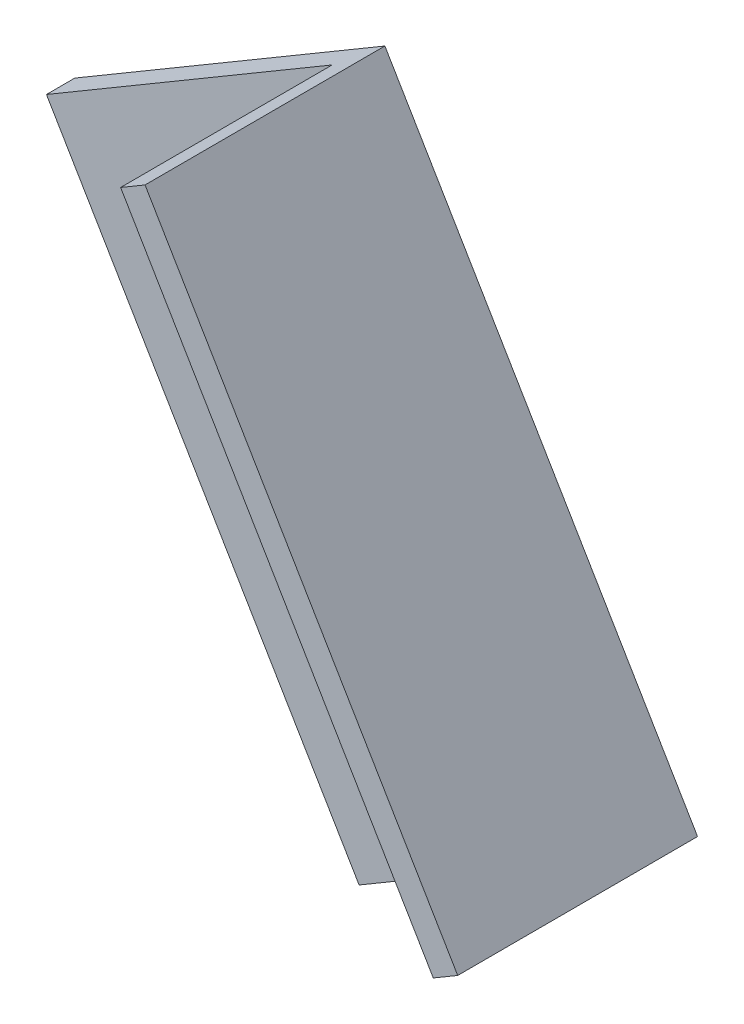
ISO-10303-21;
HEADER;
FILE_DESCRIPTION(('STEP AP214'),'2;1');
FILE_NAME('part.step','',(''),(''),'','','');
FILE_SCHEMA(('AUTOMOTIVE_DESIGN { 1 0 10303 214 1 1 1 1 }'));
ENDSEC;
DATA;
#1=APPLICATION_CONTEXT('core data for automotive mechanical design processes');
#2=APPLICATION_PROTOCOL_DEFINITION('international standard','automotive_design',2000,#1);
#3=PRODUCT_CONTEXT('',#1,'mechanical');
#4=PRODUCT('Part','Part','',(#3));
#5=PRODUCT_RELATED_PRODUCT_CATEGORY('part','',(#4));
#6=PRODUCT_DEFINITION_FORMATION('','',#4);
#7=PRODUCT_DEFINITION_CONTEXT('part definition',#1,'design');
#8=PRODUCT_DEFINITION('design','',#6,#7);
#9=PRODUCT_DEFINITION_SHAPE('','',#8);
#10=(LENGTH_UNIT() NAMED_UNIT(*) SI_UNIT(.MILLI.,.METRE.));
#11=(NAMED_UNIT(*) PLANE_ANGLE_UNIT() SI_UNIT($,.RADIAN.));
#12=(NAMED_UNIT(*) SI_UNIT($,.STERADIAN.) SOLID_ANGLE_UNIT());
#13=UNCERTAINTY_MEASURE_WITH_UNIT(LENGTH_MEASURE(1.E-05),#10,'distance_accuracy_value','');
#14=(GEOMETRIC_REPRESENTATION_CONTEXT(3) GLOBAL_UNCERTAINTY_ASSIGNED_CONTEXT((#13)) GLOBAL_UNIT_ASSIGNED_CONTEXT((#10,
#11,#12)) REPRESENTATION_CONTEXT('',''));
#15=CARTESIAN_POINT('',(0.,0.,0.));
#16=DIRECTION('',(0.,0.,1.));
#17=DIRECTION('',(1.,0.,0.));
#18=AXIS2_PLACEMENT_3D('',#15,#16,#17);
#19=CARTESIAN_POINT('',(-36.1678915375435,308.395265926204,-19.3399670064472));
#20=DIRECTION('',(0.507864835919955,-0.861435891425894,-0.00123020293928549));
#21=DIRECTION('',(0.861436543274839,0.507865220221562,-3.27313199165501E-11));
#22=AXIS2_PLACEMENT_3D('',#19,#20,#21);
#23=PLANE('',#22);
#24=DIRECTION('',(-0.000624777315184995,0.00105974175073787,-0.999999243300078));
#25=VECTOR('',#24,1.);
#26=CARTESIAN_POINT('',(-52.5843180268866,298.730712975965,-29.0399596658276));
#27=LINE('',#26,#25);
#28=CARTESIAN_POINT('',(-52.5843180268866,298.730712975965,-29.0399596658276));
#29=VERTEX_POINT('',#28);
#30=CARTESIAN_POINT('',(-52.5861923588322,298.733892201218,-32.0399573957278));
#31=VERTEX_POINT('',#30);
#32=EDGE_CURVE('E11',#29,#31,#27,.T.);
#33=ORIENTED_EDGE('',*,*,#32,.T.);
#34=DIRECTION('',(0.861436543274839,0.507865220221563,-3.3093051553522E-11));
#35=VECTOR('',#34,1.);
#36=CARTESIAN_POINT('',(-52.5861923588322,298.733892201218,-32.0399573957278));
#37=LINE('',#36,#35);
#38=CARTESIAN_POINT('',(-19.7654600600606,318.083557091659,-32.0399573969887));
#39=VERTEX_POINT('',#38);
#40=EDGE_CURVE('E163',#31,#39,#37,.T.);
#41=ORIENTED_EDGE('',*,*,#40,.T.);
#42=DIRECTION('',(0.000624777315184995,-0.00105974175073787,0.999999243300078));
#43=VECTOR('',#42,1.);
#44=CARTESIAN_POINT('',(-19.7654600600606,318.083557091659,-32.0399573969887));
#45=LINE('',#44,#43);
#46=CARTESIAN_POINT('',(-19.7495907162549,318.05663965119,-6.63997661716674));
#47=VERTEX_POINT('',#46);
#48=EDGE_CURVE('E53',#39,#47,#45,.T.);
#49=ORIENTED_EDGE('',*,*,#48,.T.);
#50=DIRECTION('',(-0.861436543274839,-0.507865220221563,3.3093051553522E-11));
#51=VECTOR('',#50,1.);
#52=CARTESIAN_POINT('',(-19.7495907162549,318.05663965119,-6.63997661716674));
#53=LINE('',#52,#51);
#54=CARTESIAN_POINT('',(-22.3339003460793,316.533043990525,-6.63997661706746));
#55=VERTEX_POINT('',#54);
#56=EDGE_CURVE('E121',#47,#55,#53,.T.);
#57=ORIENTED_EDGE('',*,*,#56,.T.);
#58=DIRECTION('',(-0.000624777315184995,0.00105974175073787,-0.999999243300078));
#59=VECTOR('',#58,1.);
#60=CARTESIAN_POINT('',(-22.3339003460793,316.533043990525,-6.63997661706747));
#61=LINE('',#60,#59);
#62=CARTESIAN_POINT('',(-22.3478953579394,316.556782205742,-29.0399596669892));
#63=VERTEX_POINT('',#62);
#64=EDGE_CURVE('E124',#55,#63,#61,.T.);
#65=ORIENTED_EDGE('',*,*,#64,.T.);
#66=DIRECTION('',(-0.861436543274839,-0.507865220221563,3.3093051553522E-11));
#67=VECTOR('',#66,1.);
#68=CARTESIAN_POINT('',(-19.763585728115,318.080377866407,-29.0399596670885));
#69=LINE('',#68,#67);
#70=EDGE_CURVE('E168',#63,#29,#69,.T.);
#71=ORIENTED_EDGE('',*,*,#70,.T.);
#72=EDGE_LOOP('',(#33,#41,#49,#57,#65,#71));
#73=FACE_BOUND('',#72,.T.);
#74=ADVANCED_FACE('F49',(#73),#23,.T.);
#75=CARTESIAN_POINT('',(-69.1791058723405,364.388598868887,-19.2600038153937));
#76=DIRECTION('',(-0.507864835919955,0.861435891425894,0.00123020293928552));
#77=DIRECTION('',(0.000624777315184995,-0.00105974175073787,0.999999243300078));
#78=AXIS2_PLACEMENT_3D('',#75,#76,#77);
#79=PLANE('',#78);
#80=DIRECTION('',(-0.000624777315184995,0.00105974175073787,-0.999999243300078));
#81=VECTOR('',#80,1.);
#82=CARTESIAN_POINT('',(-85.5955323616836,354.724045918648,-28.9599964747741));
#83=LINE('',#82,#81);
#84=CARTESIAN_POINT('',(-85.5955323616836,354.724045918648,-28.9599964747741));
#85=VERTEX_POINT('',#84);
#86=CARTESIAN_POINT('',(-85.5974066936291,354.727225143901,-31.9599942046743));
#87=VERTEX_POINT('',#86);
#88=EDGE_CURVE('E60',#85,#87,#83,.T.);
#89=ORIENTED_EDGE('',*,*,#88,.F.);
#90=DIRECTION('',(-0.861436543274839,-0.507865220221563,3.3093051553522E-11));
#91=VECTOR('',#90,1.);
#92=CARTESIAN_POINT('',(-52.774800062912,374.07371080909,-28.959996476035));
#93=LINE('',#92,#91);
#94=CARTESIAN_POINT('',(-55.3591096927369,372.550115148426,-28.9599964759357));
#95=VERTEX_POINT('',#94);
#96=EDGE_CURVE('E157',#95,#85,#93,.T.);
#97=ORIENTED_EDGE('',*,*,#96,.F.);
#98=DIRECTION('',(-0.000624777315184995,0.00105974175073787,-0.999999243300078));
#99=VECTOR('',#98,1.);
#100=CARTESIAN_POINT('',(-55.3451146808768,372.526376933209,-6.56001342601391));
#101=LINE('',#100,#99);
#102=CARTESIAN_POINT('',(-55.3451146808768,372.526376933209,-6.56001342601391));
#103=VERTEX_POINT('',#102);
#104=EDGE_CURVE('E144',#103,#95,#101,.T.);
#105=ORIENTED_EDGE('',*,*,#104,.F.);
#106=DIRECTION('',(-0.861436543274839,-0.507865220221563,3.3093051553522E-11));
#107=VECTOR('',#106,1.);
#108=CARTESIAN_POINT('',(-52.7608050510519,374.049972593873,-6.56001342611319));
#109=LINE('',#108,#107);
#110=CARTESIAN_POINT('',(-52.7608050510519,374.049972593873,-6.56001342611319));
#111=VERTEX_POINT('',#110);
#112=EDGE_CURVE('E130',#111,#103,#109,.T.);
#113=ORIENTED_EDGE('',*,*,#112,.F.);
#114=DIRECTION('',(0.000624777315184995,-0.00105974175073787,0.999999243300078));
#115=VECTOR('',#114,1.);
#116=CARTESIAN_POINT('',(-52.7766743948576,374.076890034342,-31.9599942059352));
#117=LINE('',#116,#115);
#118=CARTESIAN_POINT('',(-52.7766743948576,374.076890034342,-31.9599942059352));
#119=VERTEX_POINT('',#118);
#120=EDGE_CURVE('E171',#119,#111,#117,.T.);
#121=ORIENTED_EDGE('',*,*,#120,.F.);
#122=DIRECTION('',(0.861436543274839,0.507865220221563,-3.3093051553522E-11));
#123=VECTOR('',#122,1.);
#124=CARTESIAN_POINT('',(-85.5974066936291,354.727225143901,-31.9599942046743));
#125=LINE('',#124,#123);
#126=EDGE_CURVE('E100',#87,#119,#125,.T.);
#127=ORIENTED_EDGE('',*,*,#126,.F.);
#128=EDGE_LOOP('',(#89,#97,#105,#113,#121,#127));
#129=FACE_BOUND('',#128,.T.);
#130=ADVANCED_FACE('F202',(#129),#79,.T.);
#131=CARTESIAN_POINT('',(-85.5955323616836,354.724045918648,-28.9599964747741));
#132=DIRECTION('',(-0.861436543274838,-0.507865220221562,3.3093051514135E-11));
#133=DIRECTION('',(0.00062477722988315,-0.00105974160604962,0.999999243300284));
#134=AXIS2_PLACEMENT_3D('',#131,#132,#133);
#135=PLANE('',#134);
#136=ORIENTED_EDGE('',*,*,#88,.T.);
#137=DIRECTION('',(0.507864835919955,-0.861435891425895,-0.00123020293928549));
#138=VECTOR('',#137,1.);
#139=CARTESIAN_POINT('',(-85.5974066936291,354.727225143901,-31.9599942046743));
#140=LINE('',#139,#138);
#141=EDGE_CURVE('E156',#87,#31,#140,.T.);
#142=ORIENTED_EDGE('',*,*,#141,.T.);
#143=ORIENTED_EDGE('',*,*,#32,.F.);
#144=DIRECTION('',(0.507864835919955,-0.861435891425895,-0.00123020293928549));
#145=VECTOR('',#144,1.);
#146=CARTESIAN_POINT('',(-85.5955323616836,354.724045918648,-28.9599964747741));
#147=LINE('',#146,#145);
#148=EDGE_CURVE('E152',#85,#29,#147,.T.);
#149=ORIENTED_EDGE('',*,*,#148,.F.);
#150=EDGE_LOOP('',(#136,#142,#143,#149));
#151=FACE_BOUND('',#150,.T.);
#152=ADVANCED_FACE('F51',(#151),#135,.T.);
#153=CARTESIAN_POINT('',(-85.5974066936291,354.727225143901,-31.9599942046743));
#154=DIRECTION('',(-0.000624777315184981,0.00105974175073784,-0.999999243300078));
#155=DIRECTION('',(-0.862528314570682,-0.506008800868955,2.64947413173238E-06));
#156=AXIS2_PLACEMENT_3D('',#153,#154,#155);
#157=PLANE('',#156);
#158=ORIENTED_EDGE('',*,*,#126,.T.);
#159=DIRECTION('',(0.507864835919955,-0.861435891425895,-0.00123020293928549));
#160=VECTOR('',#159,1.);
#161=CARTESIAN_POINT('',(-52.7766743948576,374.076890034342,-31.9599942059352));
#162=LINE('',#161,#160);
#163=EDGE_CURVE('E173',#119,#39,#162,.T.);
#164=ORIENTED_EDGE('',*,*,#163,.T.);
#165=ORIENTED_EDGE('',*,*,#40,.F.);
#166=ORIENTED_EDGE('',*,*,#141,.F.);
#167=EDGE_LOOP('',(#158,#164,#165,#166));
#168=FACE_BOUND('',#167,.T.);
#169=ADVANCED_FACE('F207',(#168),#157,.T.);
#170=CARTESIAN_POINT('',(-52.7766743948576,374.076890034342,-31.9599942059352));
#171=DIRECTION('',(0.861436543274838,0.507865220221562,-3.3093051514135E-11));
#172=DIRECTION('',(-0.000624777315184995,0.00105974175073787,-0.999999243300078));
#173=AXIS2_PLACEMENT_3D('',#170,#171,#172);
#174=PLANE('',#173);
#175=ORIENTED_EDGE('',*,*,#120,.T.);
#176=DIRECTION('',(0.507864835919955,-0.861435891425895,-0.00123020293928549));
#177=VECTOR('',#176,1.);
#178=CARTESIAN_POINT('',(-52.7608050510519,374.049972593873,-6.56001342611319));
#179=LINE('',#178,#177);
#180=EDGE_CURVE('E129',#111,#47,#179,.T.);
#181=ORIENTED_EDGE('',*,*,#180,.T.);
#182=ORIENTED_EDGE('',*,*,#48,.F.);
#183=ORIENTED_EDGE('',*,*,#163,.F.);
#184=EDGE_LOOP('',(#175,#181,#182,#183));
#185=FACE_BOUND('',#184,.T.);
#186=ADVANCED_FACE('F205',(#185),#174,.T.);
#187=CARTESIAN_POINT('',(-52.7608050510519,374.049972593873,-6.56001342611319));
#188=DIRECTION('',(0.000624777315184981,-0.00105974175073784,0.999999243300078));
#189=DIRECTION('',(0.862528314570682,0.506008800868955,-2.64947413173238E-06));
#190=AXIS2_PLACEMENT_3D('',#187,#188,#189);
#191=PLANE('',#190);
#192=ORIENTED_EDGE('',*,*,#112,.T.);
#193=DIRECTION('',(0.507864835919955,-0.861435891425895,-0.00123020293928549));
#194=VECTOR('',#193,1.);
#195=CARTESIAN_POINT('',(-55.3451146808768,372.526376933209,-6.56001342601391));
#196=LINE('',#195,#194);
#197=EDGE_CURVE('E132',#103,#55,#196,.T.);
#198=ORIENTED_EDGE('',*,*,#197,.T.);
#199=ORIENTED_EDGE('',*,*,#56,.F.);
#200=ORIENTED_EDGE('',*,*,#180,.F.);
#201=EDGE_LOOP('',(#192,#198,#199,#200));
#202=FACE_BOUND('',#201,.T.);
#203=ADVANCED_FACE('F133',(#202),#191,.T.);
#204=CARTESIAN_POINT('',(-55.3451146808768,372.526376933209,-6.56001342601391));
#205=DIRECTION('',(-0.861436543274838,-0.507865220221562,3.3093051514135E-11));
#206=DIRECTION('',(0.00062477722988315,-0.00105974160604962,0.999999243300284));
#207=AXIS2_PLACEMENT_3D('',#204,#205,#206);
#208=PLANE('',#207);
#209=ORIENTED_EDGE('',*,*,#104,.T.);
#210=DIRECTION('',(0.507864835919955,-0.861435891425895,-0.00123020293928549));
#211=VECTOR('',#210,1.);
#212=CARTESIAN_POINT('',(-55.3591096927369,372.550115148426,-28.9599964759357));
#213=LINE('',#212,#211);
#214=EDGE_CURVE('E141',#95,#63,#213,.T.);
#215=ORIENTED_EDGE('',*,*,#214,.T.);
#216=ORIENTED_EDGE('',*,*,#64,.F.);
#217=ORIENTED_EDGE('',*,*,#197,.F.);
#218=EDGE_LOOP('',(#209,#215,#216,#217));
#219=FACE_BOUND('',#218,.T.);
#220=ADVANCED_FACE('F139',(#219),#208,.T.);
#221=CARTESIAN_POINT('',(-55.3591096927369,372.550115148426,-28.9599964759357));
#222=DIRECTION('',(0.000624777315184981,-0.00105974175073784,0.999999243300078));
#223=DIRECTION('',(0.862528314570682,0.506008800868955,-2.64947413173238E-06));
#224=AXIS2_PLACEMENT_3D('',#221,#222,#223);
#225=PLANE('',#224);
#226=ORIENTED_EDGE('',*,*,#96,.T.);
#227=ORIENTED_EDGE('',*,*,#148,.T.);
#228=ORIENTED_EDGE('',*,*,#70,.F.);
#229=ORIENTED_EDGE('',*,*,#214,.F.);
#230=EDGE_LOOP('',(#226,#227,#228,#229));
#231=FACE_BOUND('',#230,.T.);
#232=ADVANCED_FACE('F195',(#231),#225,.T.);
#233=CLOSED_SHELL('',(#74,#130,#152,#169,#186,#203,#220,#232));
#234=MANIFOLD_SOLID_BREP('B2',#233);
#235=ADVANCED_BREP_SHAPE_REPRESENTATION('',(#18,#234),#14);
#236=SHAPE_DEFINITION_REPRESENTATION(#9,#235);
ENDSEC;
END-ISO-10303-21;
